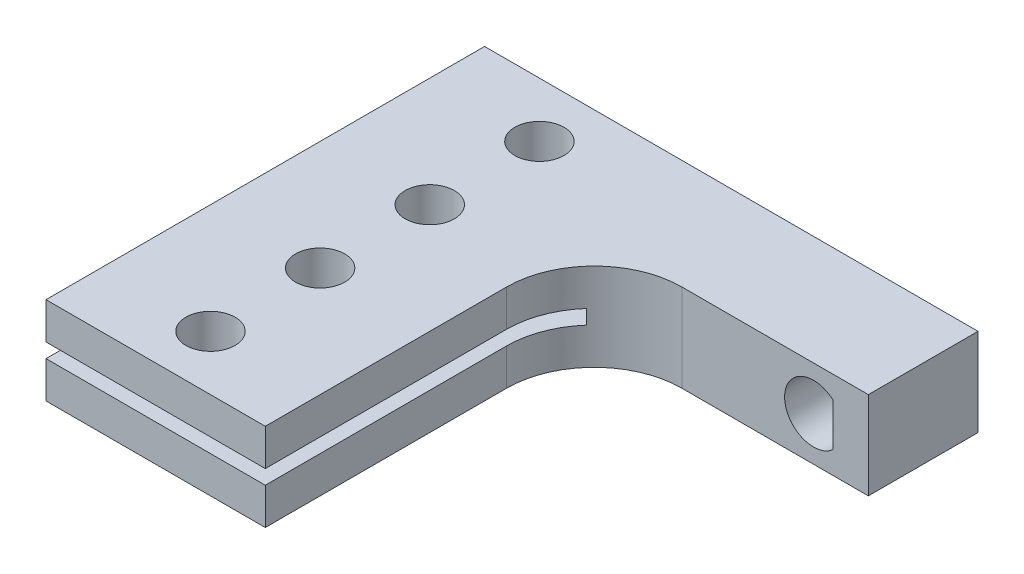
ISO-10303-21;
HEADER;
FILE_DESCRIPTION(('STEP AP214'),'2;1');
FILE_NAME('part.step','',(''),(''),'','','');
FILE_SCHEMA(('AUTOMOTIVE_DESIGN { 1 0 10303 214 1 1 1 1 }'));
ENDSEC;
DATA;
#1=APPLICATION_CONTEXT('core data for automotive mechanical design processes');
#2=APPLICATION_PROTOCOL_DEFINITION('international standard','automotive_design',2000,#1);
#3=PRODUCT_CONTEXT('',#1,'mechanical');
#4=PRODUCT('Part','Part','',(#3));
#5=PRODUCT_RELATED_PRODUCT_CATEGORY('part','',(#4));
#6=PRODUCT_DEFINITION_FORMATION('','',#4);
#7=PRODUCT_DEFINITION_CONTEXT('part definition',#1,'design');
#8=PRODUCT_DEFINITION('design','',#6,#7);
#9=PRODUCT_DEFINITION_SHAPE('','',#8);
#10=(LENGTH_UNIT() NAMED_UNIT(*) SI_UNIT(.MILLI.,.METRE.));
#11=(NAMED_UNIT(*) PLANE_ANGLE_UNIT() SI_UNIT($,.RADIAN.));
#12=(NAMED_UNIT(*) SI_UNIT($,.STERADIAN.) SOLID_ANGLE_UNIT());
#13=UNCERTAINTY_MEASURE_WITH_UNIT(LENGTH_MEASURE(1.E-05),#10,'distance_accuracy_value','');
#14=(GEOMETRIC_REPRESENTATION_CONTEXT(3) GLOBAL_UNCERTAINTY_ASSIGNED_CONTEXT((#13)) GLOBAL_UNIT_ASSIGNED_CONTEXT((#10,
#11,#12)) REPRESENTATION_CONTEXT('',''));
#15=CARTESIAN_POINT('',(0.,0.,0.));
#16=DIRECTION('',(0.,0.,1.));
#17=DIRECTION('',(1.,0.,0.));
#18=AXIS2_PLACEMENT_3D('',#15,#16,#17);
#19=CARTESIAN_POINT('',(-33.0969696969697,5.08,20.0121212121212));
#20=DIRECTION('',(1.,0.,0.));
#21=DIRECTION('',(0.,0.,-1.));
#22=AXIS2_PLACEMENT_3D('',#19,#20,#21);
#23=PLANE('',#22);
#24=DIRECTION('',(0.,-1.,0.));
#25=VECTOR('',#24,1.);
#26=CARTESIAN_POINT('',(-33.0969696969697,5.08,-5.38787878787881));
#27=LINE('',#26,#25);
#28=CARTESIAN_POINT('',(-33.0969696969697,5.08,-5.38787878787881));
#29=VERTEX_POINT('',#28);
#30=CARTESIAN_POINT('',(-33.0969696969697,2.95671875,-5.38787878787881));
#31=VERTEX_POINT('',#30);
#32=EDGE_CURVE('E258',#29,#31,#27,.T.);
#33=ORIENTED_EDGE('',*,*,#32,.T.);
#34=DIRECTION('',(0.,0.,-1.));
#35=VECTOR('',#34,1.);
#36=CARTESIAN_POINT('',(-33.0969696969697,2.95671875,-5.38787878787881));
#37=LINE('',#36,#35);
#38=CARTESIAN_POINT('',(-33.0969696969697,2.95671875,20.0121212121212));
#39=VERTEX_POINT('',#38);
#40=EDGE_CURVE('E206',#39,#31,#37,.T.);
#41=ORIENTED_EDGE('',*,*,#40,.F.);
#42=DIRECTION('',(0.,-1.,0.));
#43=VECTOR('',#42,1.);
#44=CARTESIAN_POINT('',(-33.0969696969697,5.08,20.0121212121212));
#45=LINE('',#44,#43);
#46=CARTESIAN_POINT('',(-33.0969696969697,5.08,20.0121212121212));
#47=VERTEX_POINT('',#46);
#48=EDGE_CURVE('E272',#47,#39,#45,.T.);
#49=ORIENTED_EDGE('',*,*,#48,.F.);
#50=DIRECTION('',(0.,0.,1.));
#51=VECTOR('',#50,1.);
#52=CARTESIAN_POINT('',(-33.0969696969697,5.08,20.0121212121212));
#53=LINE('',#52,#51);
#54=EDGE_CURVE('E227',#29,#47,#53,.T.);
#55=ORIENTED_EDGE('',*,*,#54,.F.);
#56=EDGE_LOOP('',(#33,#41,#49,#55));
#57=FACE_BOUND('',#56,.T.);
#58=ADVANCED_FACE('F35',(#57),#23,.F.);
#59=CARTESIAN_POINT('',(-20.3969696969697,5.08,20.0121212121212));
#60=DIRECTION('',(0.,0.,-1.));
#61=DIRECTION('',(-1.,0.,0.));
#62=AXIS2_PLACEMENT_3D('',#59,#60,#61);
#63=PLANE('',#62);
#64=ORIENTED_EDGE('',*,*,#48,.T.);
#65=DIRECTION('',(-1.,0.,0.));
#66=VECTOR('',#65,1.);
#67=CARTESIAN_POINT('',(-19.1269696969697,2.95671875,20.0121212121212));
#68=LINE('',#67,#66);
#69=CARTESIAN_POINT('',(-20.3969696969697,2.95671875,20.0121212121212));
#70=VERTEX_POINT('',#69);
#71=EDGE_CURVE('E216',#70,#39,#68,.T.);
#72=ORIENTED_EDGE('',*,*,#71,.F.);
#73=DIRECTION('',(0.,-1.,0.));
#74=VECTOR('',#73,1.);
#75=CARTESIAN_POINT('',(-20.3969696969697,5.08,20.0121212121212));
#76=LINE('',#75,#74);
#77=CARTESIAN_POINT('',(-20.3969696969697,5.08,20.0121212121212));
#78=VERTEX_POINT('',#77);
#79=EDGE_CURVE('E268',#78,#70,#76,.T.);
#80=ORIENTED_EDGE('',*,*,#79,.F.);
#81=DIRECTION('',(1.,0.,0.));
#82=VECTOR('',#81,1.);
#83=CARTESIAN_POINT('',(-20.3969696969697,5.08,20.0121212121212));
#84=LINE('',#83,#82);
#85=EDGE_CURVE('E230',#47,#78,#84,.T.);
#86=ORIENTED_EDGE('',*,*,#85,.F.);
#87=EDGE_LOOP('',(#64,#72,#80,#86));
#88=FACE_BOUND('',#87,.T.);
#89=ADVANCED_FACE('F330',(#88),#63,.F.);
#90=CARTESIAN_POINT('',(-20.3969696969697,5.08,0.962121212121189));
#91=DIRECTION('',(-1.,0.,0.));
#92=DIRECTION('',(0.,0.,1.));
#93=AXIS2_PLACEMENT_3D('',#90,#91,#92);
#94=PLANE('',#93);
#95=DIRECTION('',(0.,0.,-1.));
#96=VECTOR('',#95,1.);
#97=CARTESIAN_POINT('',(-20.3969696969697,2.95671875,0.962121212121189));
#98=LINE('',#97,#96);
#99=CARTESIAN_POINT('',(-20.3969696969697,2.95671875,6.04212121212119));
#100=VERTEX_POINT('',#99);
#101=EDGE_CURVE('E223',#70,#100,#98,.T.);
#102=ORIENTED_EDGE('',*,*,#101,.T.);
#103=DIRECTION('',(0.,-1.,0.));
#104=VECTOR('',#103,1.);
#105=CARTESIAN_POINT('',(-20.3969696969697,5.08,6.04212121212119));
#106=LINE('',#105,#104);
#107=CARTESIAN_POINT('',(-20.3969696969697,5.08,6.04212121212119));
#108=VERTEX_POINT('',#107);
#109=EDGE_CURVE('E291',#100,#108,#106,.F.);
#110=ORIENTED_EDGE('',*,*,#109,.T.);
#111=DIRECTION('',(0.,0.,-1.));
#112=VECTOR('',#111,1.);
#113=CARTESIAN_POINT('',(-20.3969696969697,5.08,0.962121212121189));
#114=LINE('',#113,#112);
#115=EDGE_CURVE('E233',#78,#108,#114,.T.);
#116=ORIENTED_EDGE('',*,*,#115,.F.);
#117=ORIENTED_EDGE('',*,*,#79,.T.);
#118=EDGE_LOOP('',(#102,#110,#116,#117));
#119=FACE_BOUND('',#118,.T.);
#120=ADVANCED_FACE('F305',(#119),#94,.F.);
#121=CARTESIAN_POINT('',(-33.0969696969697,2.12328125,20.0121212121212));
#122=VERTEX_POINT('',#121);
#123=CARTESIAN_POINT('',(-33.0969696969697,0.,20.0121212121212));
#124=VERTEX_POINT('',#123);
#125=EDGE_CURVE('E271',#122,#124,#45,.T.);
#126=ORIENTED_EDGE('',*,*,#125,.F.);
#127=DIRECTION('',(0.,0.,1.));
#128=VECTOR('',#127,1.);
#129=CARTESIAN_POINT('',(-33.0969696969697,2.12328125,-5.38787878787881));
#130=LINE('',#129,#128);
#131=CARTESIAN_POINT('',(-33.0969696969697,2.12328125,-5.38787878787881));
#132=VERTEX_POINT('',#131);
#133=EDGE_CURVE('E203',#132,#122,#130,.T.);
#134=ORIENTED_EDGE('',*,*,#133,.F.);
#135=CARTESIAN_POINT('',(-33.0969696969697,0.,-5.38787878787881));
#136=VERTEX_POINT('',#135);
#137=EDGE_CURVE('E242',#132,#136,#27,.T.);
#138=ORIENTED_EDGE('',*,*,#137,.T.);
#139=DIRECTION('',(0.,0.,1.));
#140=VECTOR('',#139,1.);
#141=CARTESIAN_POINT('',(-33.0969696969697,0.,20.0121212121212));
#142=LINE('',#141,#140);
#143=EDGE_CURVE('E226',#136,#124,#142,.T.);
#144=ORIENTED_EDGE('',*,*,#143,.T.);
#145=EDGE_LOOP('',(#126,#134,#138,#144));
#146=FACE_BOUND('',#145,.T.);
#147=ADVANCED_FACE('F341',(#146),#23,.F.);
#148=CARTESIAN_POINT('',(-20.3969696969697,2.12328125,20.0121212121212));
#149=VERTEX_POINT('',#148);
#150=CARTESIAN_POINT('',(-20.3969696969697,0.,20.0121212121212));
#151=VERTEX_POINT('',#150);
#152=EDGE_CURVE('E267',#149,#151,#76,.T.);
#153=ORIENTED_EDGE('',*,*,#152,.F.);
#154=DIRECTION('',(-1.,0.,0.));
#155=VECTOR('',#154,1.);
#156=CARTESIAN_POINT('',(-19.1269696969697,2.12328125,20.0121212121212));
#157=LINE('',#156,#155);
#158=EDGE_CURVE('E218',#149,#122,#157,.T.);
#159=ORIENTED_EDGE('',*,*,#158,.T.);
#160=ORIENTED_EDGE('',*,*,#125,.T.);
#161=DIRECTION('',(1.,0.,0.));
#162=VECTOR('',#161,1.);
#163=CARTESIAN_POINT('',(-20.3969696969697,0.,20.0121212121212));
#164=LINE('',#163,#162);
#165=EDGE_CURVE('E245',#124,#151,#164,.T.);
#166=ORIENTED_EDGE('',*,*,#165,.T.);
#167=EDGE_LOOP('',(#153,#159,#160,#166));
#168=FACE_BOUND('',#167,.T.);
#169=ADVANCED_FACE('F346',(#168),#63,.F.);
#170=DIRECTION('',(0.,0.,-1.));
#171=VECTOR('',#170,1.);
#172=CARTESIAN_POINT('',(-20.3969696969697,0.,0.962121212121189));
#173=LINE('',#172,#171);
#174=CARTESIAN_POINT('',(-20.3969696969697,0.,6.04212121212119));
#175=VERTEX_POINT('',#174);
#176=EDGE_CURVE('E248',#151,#175,#173,.T.);
#177=ORIENTED_EDGE('',*,*,#176,.T.);
#178=DIRECTION('',(0.,1.,0.));
#179=VECTOR('',#178,1.);
#180=CARTESIAN_POINT('',(-20.3969696969697,1.061640625,6.04212121212119));
#181=LINE('',#180,#179);
#182=CARTESIAN_POINT('',(-20.3969696969697,2.12328125,6.04212121212119));
#183=VERTEX_POINT('',#182);
#184=EDGE_CURVE('E289',#175,#183,#181,.T.);
#185=ORIENTED_EDGE('',*,*,#184,.T.);
#186=DIRECTION('',(0.,0.,1.));
#187=VECTOR('',#186,1.);
#188=CARTESIAN_POINT('',(-20.3969696969697,2.12328125,0.962121212121189));
#189=LINE('',#188,#187);
#190=EDGE_CURVE('E215',#183,#149,#189,.T.);
#191=ORIENTED_EDGE('',*,*,#190,.T.);
#192=ORIENTED_EDGE('',*,*,#152,.T.);
#193=EDGE_LOOP('',(#177,#185,#191,#192));
#194=FACE_BOUND('',#193,.T.);
#195=ADVANCED_FACE('F352',(#194),#94,.F.);
#196=CARTESIAN_POINT('',(-4.52196969696969,5.08,0.962121212121185));
#197=DIRECTION('',(0.,0.,-1.));
#198=DIRECTION('',(-1.,0.,0.));
#199=AXIS2_PLACEMENT_3D('',#196,#197,#198);
#200=PLANE('',#199);
#201=DIRECTION('',(0.,1.,0.));
#202=VECTOR('',#201,1.);
#203=CARTESIAN_POINT('',(-6.57936969696969,1.29048521417312,0.962121212121184));
#204=LINE('',#203,#202);
#205=CARTESIAN_POINT('',(-6.57936969696969,1.29048521417312,0.962121212121186));
#206=VERTEX_POINT('',#205);
#207=CARTESIAN_POINT('',(-6.57936969696969,3.78951478582688,0.962121212121184));
#208=VERTEX_POINT('',#207);
#209=EDGE_CURVE('E155',#206,#208,#204,.T.);
#210=ORIENTED_EDGE('',*,*,#209,.F.);
#211=CARTESIAN_POINT('',(-7.69696969696969,2.54,0.962121212121184));
#212=DIRECTION('',(0.,0.,1.));
#213=DIRECTION('',(1.,0.,0.));
#214=AXIS2_PLACEMENT_3D('',#211,#212,#213);
#215=CIRCLE('',#214,1.6764);
#216=EDGE_CURVE('E145',#208,#206,#215,.T.);
#217=ORIENTED_EDGE('',*,*,#216,.F.);
#218=EDGE_LOOP('',(#210,#217));
#219=FACE_BOUND('',#218,.T.);
#220=DIRECTION('',(1.,0.,0.));
#221=VECTOR('',#220,1.);
#222=CARTESIAN_POINT('',(-4.52196969696969,5.08,0.962121212121185));
#223=LINE('',#222,#221);
#224=CARTESIAN_POINT('',(-15.3169696969697,5.08,0.962121212121188));
#225=VERTEX_POINT('',#224);
#226=CARTESIAN_POINT('',(-4.52196969696969,5.08,0.962121212121185));
#227=VERTEX_POINT('',#226);
#228=EDGE_CURVE('E236',#225,#227,#223,.T.);
#229=ORIENTED_EDGE('',*,*,#228,.F.);
#230=DIRECTION('',(0.,-1.,0.));
#231=VECTOR('',#230,1.);
#232=CARTESIAN_POINT('',(-15.3169696969697,2.95671875,0.962121212121188));
#233=LINE('',#232,#231);
#234=CARTESIAN_POINT('',(-15.3169696969697,0.,0.962121212121188));
#235=VERTEX_POINT('',#234);
#236=EDGE_CURVE('E286',#225,#235,#233,.T.);
#237=ORIENTED_EDGE('',*,*,#236,.T.);
#238=DIRECTION('',(1.,0.,0.));
#239=VECTOR('',#238,1.);
#240=CARTESIAN_POINT('',(-4.52196969696969,0.,0.962121212121185));
#241=LINE('',#240,#239);
#242=CARTESIAN_POINT('',(-4.52196969696969,0.,0.962121212121185));
#243=VERTEX_POINT('',#242);
#244=EDGE_CURVE('E251',#235,#243,#241,.T.);
#245=ORIENTED_EDGE('',*,*,#244,.T.);
#246=DIRECTION('',(0.,-1.,0.));
#247=VECTOR('',#246,1.);
#248=CARTESIAN_POINT('',(-4.52196969696969,5.08,0.962121212121185));
#249=LINE('',#248,#247);
#250=EDGE_CURVE('E264',#227,#243,#249,.T.);
#251=ORIENTED_EDGE('',*,*,#250,.F.);
#252=EDGE_LOOP('',(#229,#237,#245,#251));
#253=FACE_BOUND('',#252,.T.);
#254=ADVANCED_FACE('F159',(#219,#253),#200,.F.);
#255=CARTESIAN_POINT('',(-4.52196969696969,5.08,-5.38787878787881));
#256=DIRECTION('',(-1.,0.,0.));
#257=DIRECTION('',(0.,0.,1.));
#258=AXIS2_PLACEMENT_3D('',#255,#256,#257);
#259=PLANE('',#258);
#260=DIRECTION('',(0.,0.,-1.));
#261=VECTOR('',#260,1.);
#262=CARTESIAN_POINT('',(-4.52196969696969,0.,-5.38787878787881));
#263=LINE('',#262,#261);
#264=CARTESIAN_POINT('',(-4.52196969696969,0.,-5.38787878787881));
#265=VERTEX_POINT('',#264);
#266=EDGE_CURVE('E253',#243,#265,#263,.T.);
#267=ORIENTED_EDGE('',*,*,#266,.T.);
#268=DIRECTION('',(0.,-1.,0.));
#269=VECTOR('',#268,1.);
#270=CARTESIAN_POINT('',(-4.52196969696969,5.08,-5.38787878787881));
#271=LINE('',#270,#269);
#272=CARTESIAN_POINT('',(-4.52196969696969,5.08,-5.38787878787881));
#273=VERTEX_POINT('',#272);
#274=EDGE_CURVE('E261',#273,#265,#271,.T.);
#275=ORIENTED_EDGE('',*,*,#274,.F.);
#276=DIRECTION('',(0.,0.,-1.));
#277=VECTOR('',#276,1.);
#278=CARTESIAN_POINT('',(-4.52196969696969,5.08,-5.38787878787881));
#279=LINE('',#278,#277);
#280=EDGE_CURVE('E238',#227,#273,#279,.T.);
#281=ORIENTED_EDGE('',*,*,#280,.F.);
#282=ORIENTED_EDGE('',*,*,#250,.T.);
#283=EDGE_LOOP('',(#267,#275,#281,#282));
#284=FACE_BOUND('',#283,.T.);
#285=ADVANCED_FACE('F319',(#284),#259,.F.);
#286=CARTESIAN_POINT('',(-33.0969696969697,5.08,-5.38787878787881));
#287=DIRECTION('',(0.,0.,1.));
#288=DIRECTION('',(1.,0.,0.));
#289=AXIS2_PLACEMENT_3D('',#286,#287,#288);
#290=PLANE('',#289);
#291=DIRECTION('',(0.,1.,0.));
#292=VECTOR('',#291,1.);
#293=CARTESIAN_POINT('',(-6.57936969696969,5.08,-5.3878787878788));
#294=LINE('',#293,#292);
#295=CARTESIAN_POINT('',(-6.57936969696969,1.29048521417312,-5.3878787878788));
#296=VERTEX_POINT('',#295);
#297=CARTESIAN_POINT('',(-6.57936969696969,3.78951478582688,-5.3878787878788));
#298=VERTEX_POINT('',#297);
#299=EDGE_CURVE('E275',#296,#298,#294,.T.);
#300=ORIENTED_EDGE('',*,*,#299,.T.);
#301=CARTESIAN_POINT('',(-7.69696969696969,2.54,-5.3878787878788));
#302=DIRECTION('',(0.,0.,1.));
#303=DIRECTION('',(1.,0.,0.));
#304=AXIS2_PLACEMENT_3D('',#301,#302,#303);
#305=CIRCLE('',#304,1.6764);
#306=EDGE_CURVE('E148',#298,#296,#305,.T.);
#307=ORIENTED_EDGE('',*,*,#306,.T.);
#308=EDGE_LOOP('',(#300,#307));
#309=FACE_BOUND('',#308,.T.);
#310=DIRECTION('',(0.,-1.,0.));
#311=VECTOR('',#310,1.);
#312=CARTESIAN_POINT('',(-19.1269696969697,2.95671875,-5.38787878787881));
#313=LINE('',#312,#311);
#314=CARTESIAN_POINT('',(-19.1269696969697,2.95671875,-5.3878787878788));
#315=VERTEX_POINT('',#314);
#316=CARTESIAN_POINT('',(-19.1269696969697,2.12328125,-5.38787878787881));
#317=VERTEX_POINT('',#316);
#318=EDGE_CURVE('E204',#315,#317,#313,.T.);
#319=ORIENTED_EDGE('',*,*,#318,.F.);
#320=DIRECTION('',(-1.,0.,0.));
#321=VECTOR('',#320,1.);
#322=CARTESIAN_POINT('',(-19.1269696969697,2.95671875,-5.38787878787881));
#323=LINE('',#322,#321);
#324=EDGE_CURVE('E212',#315,#31,#323,.T.);
#325=ORIENTED_EDGE('',*,*,#324,.T.);
#326=ORIENTED_EDGE('',*,*,#32,.F.);
#327=DIRECTION('',(-1.,0.,0.));
#328=VECTOR('',#327,1.);
#329=CARTESIAN_POINT('',(-20.3969696969697,5.08,-5.3878787878788));
#330=LINE('',#329,#328);
#331=EDGE_CURVE('E240',#273,#29,#330,.T.);
#332=ORIENTED_EDGE('',*,*,#331,.F.);
#333=ORIENTED_EDGE('',*,*,#274,.T.);
#334=DIRECTION('',(-1.,0.,0.));
#335=VECTOR('',#334,1.);
#336=CARTESIAN_POINT('',(-33.0969696969697,0.,-5.38787878787881));
#337=LINE('',#336,#335);
#338=EDGE_CURVE('E231',#265,#136,#337,.T.);
#339=ORIENTED_EDGE('',*,*,#338,.T.);
#340=ORIENTED_EDGE('',*,*,#137,.F.);
#341=DIRECTION('',(-1.,0.,0.));
#342=VECTOR('',#341,1.);
#343=CARTESIAN_POINT('',(-19.1269696969697,2.12328125,-5.38787878787881));
#344=LINE('',#343,#342);
#345=EDGE_CURVE('E209',#317,#132,#344,.T.);
#346=ORIENTED_EDGE('',*,*,#345,.F.);
#347=EDGE_LOOP('',(#319,#325,#326,#332,#333,#339,#340,#346));
#348=FACE_BOUND('',#347,.T.);
#349=ADVANCED_FACE('F326',(#309,#348),#290,.F.);
#350=CARTESIAN_POINT('',(0.,5.08,0.));
#351=DIRECTION('',(0.,-1.,0.));
#352=DIRECTION('',(0.,0.,-1.));
#353=AXIS2_PLACEMENT_3D('',#350,#351,#352);
#354=PLANE('',#353);
#355=CARTESIAN_POINT('',(-26.7469696969697,5.08,-2.21287878787881));
#356=DIRECTION('',(0.,1.,0.));
#357=DIRECTION('',(0.,0.,1.));
#358=AXIS2_PLACEMENT_3D('',#355,#356,#357);
#359=CIRCLE('',#358,1.4224);
#360=CARTESIAN_POINT('',(-26.7469696969697,5.08,-0.790478787878804));
#361=VERTEX_POINT('',#360);
#362=EDGE_CURVE('E151',#361,#361,#359,.T.);
#363=ORIENTED_EDGE('',*,*,#362,.F.);
#364=EDGE_LOOP('',(#363));
#365=FACE_BOUND('',#364,.T.);
#366=CARTESIAN_POINT('',(-26.7469696969697,5.08,4.13712121212119));
#367=DIRECTION('',(0.,1.,0.));
#368=DIRECTION('',(0.,0.,1.));
#369=AXIS2_PLACEMENT_3D('',#366,#367,#368);
#370=CIRCLE('',#369,1.4224);
#371=CARTESIAN_POINT('',(-26.7469696969697,5.08,5.55952121212119));
#372=VERTEX_POINT('',#371);
#373=EDGE_CURVE('E173',#372,#372,#370,.T.);
#374=ORIENTED_EDGE('',*,*,#373,.F.);
#375=EDGE_LOOP('',(#374));
#376=FACE_BOUND('',#375,.T.);
#377=CARTESIAN_POINT('',(-26.7469696969697,5.08,10.4871212121212));
#378=DIRECTION('',(0.,1.,0.));
#379=DIRECTION('',(0.,0.,1.));
#380=AXIS2_PLACEMENT_3D('',#377,#378,#379);
#381=CIRCLE('',#380,1.4224);
#382=CARTESIAN_POINT('',(-26.7469696969697,5.08,11.9095212121212));
#383=VERTEX_POINT('',#382);
#384=EDGE_CURVE('E183',#383,#383,#381,.T.);
#385=ORIENTED_EDGE('',*,*,#384,.F.);
#386=EDGE_LOOP('',(#385));
#387=FACE_BOUND('',#386,.T.);
#388=CARTESIAN_POINT('',(-26.7469696969697,5.08,16.8371212121212));
#389=DIRECTION('',(0.,1.,0.));
#390=DIRECTION('',(0.,0.,1.));
#391=AXIS2_PLACEMENT_3D('',#388,#389,#390);
#392=CIRCLE('',#391,1.4224);
#393=CARTESIAN_POINT('',(-26.7469696969697,5.08,18.2595212121212));
#394=VERTEX_POINT('',#393);
#395=EDGE_CURVE('E193',#394,#394,#392,.T.);
#396=ORIENTED_EDGE('',*,*,#395,.F.);
#397=EDGE_LOOP('',(#396));
#398=FACE_BOUND('',#397,.T.);
#399=ORIENTED_EDGE('',*,*,#54,.T.);
#400=ORIENTED_EDGE('',*,*,#85,.T.);
#401=ORIENTED_EDGE('',*,*,#115,.T.);
#402=CARTESIAN_POINT('',(-15.3169696969697,5.08,6.04212121212119));
#403=DIRECTION('',(0.,-1.,0.));
#404=DIRECTION('',(0.,0.,-1.));
#405=AXIS2_PLACEMENT_3D('',#402,#403,#404);
#406=CIRCLE('',#405,5.08);
#407=EDGE_CURVE('E11',#108,#225,#406,.T.);
#408=ORIENTED_EDGE('',*,*,#407,.T.);
#409=ORIENTED_EDGE('',*,*,#228,.T.);
#410=ORIENTED_EDGE('',*,*,#280,.T.);
#411=ORIENTED_EDGE('',*,*,#331,.T.);
#412=EDGE_LOOP('',(#399,#400,#401,#408,#409,#410,#411));
#413=FACE_BOUND('',#412,.T.);
#414=ADVANCED_FACE('F312',(#365,#376,#387,#398,#413),#354,.F.);
#415=CARTESIAN_POINT('',(0.,0.,0.));
#416=DIRECTION('',(0.,-1.,0.));
#417=DIRECTION('',(0.,0.,-1.));
#418=AXIS2_PLACEMENT_3D('',#415,#416,#417);
#419=PLANE('',#418);
#420=CARTESIAN_POINT('',(-26.7469696969697,0.,-2.21287878787881));
#421=DIRECTION('',(0.,-1.,0.));
#422=DIRECTION('',(0.,0.,-1.));
#423=AXIS2_PLACEMENT_3D('',#420,#421,#422);
#424=CIRCLE('',#423,1.4224);
#425=CARTESIAN_POINT('',(-26.7469696969697,0.,-3.63527878787881));
#426=VERTEX_POINT('',#425);
#427=EDGE_CURVE('E170',#426,#426,#424,.T.);
#428=ORIENTED_EDGE('',*,*,#427,.F.);
#429=EDGE_LOOP('',(#428));
#430=FACE_BOUND('',#429,.T.);
#431=CARTESIAN_POINT('',(-26.7469696969697,0.,4.13712121212119));
#432=DIRECTION('',(0.,-1.,0.));
#433=DIRECTION('',(0.,0.,-1.));
#434=AXIS2_PLACEMENT_3D('',#431,#432,#433);
#435=CIRCLE('',#434,1.4224);
#436=CARTESIAN_POINT('',(-26.7469696969697,0.,2.71472121212119));
#437=VERTEX_POINT('',#436);
#438=EDGE_CURVE('E180',#437,#437,#435,.T.);
#439=ORIENTED_EDGE('',*,*,#438,.F.);
#440=EDGE_LOOP('',(#439));
#441=FACE_BOUND('',#440,.T.);
#442=CARTESIAN_POINT('',(-26.7469696969697,0.,10.4871212121212));
#443=DIRECTION('',(0.,-1.,0.));
#444=DIRECTION('',(0.,0.,-1.));
#445=AXIS2_PLACEMENT_3D('',#442,#443,#444);
#446=CIRCLE('',#445,1.4224);
#447=CARTESIAN_POINT('',(-26.7469696969697,0.,9.06472121212119));
#448=VERTEX_POINT('',#447);
#449=EDGE_CURVE('E190',#448,#448,#446,.T.);
#450=ORIENTED_EDGE('',*,*,#449,.F.);
#451=EDGE_LOOP('',(#450));
#452=FACE_BOUND('',#451,.T.);
#453=CARTESIAN_POINT('',(-26.7469696969697,0.,16.8371212121212));
#454=DIRECTION('',(0.,-1.,0.));
#455=DIRECTION('',(0.,0.,-1.));
#456=AXIS2_PLACEMENT_3D('',#453,#454,#455);
#457=CIRCLE('',#456,1.4224);
#458=CARTESIAN_POINT('',(-26.7469696969697,0.,15.4147212121212));
#459=VERTEX_POINT('',#458);
#460=EDGE_CURVE('E200',#459,#459,#457,.T.);
#461=ORIENTED_EDGE('',*,*,#460,.F.);
#462=EDGE_LOOP('',(#461));
#463=FACE_BOUND('',#462,.T.);
#464=ORIENTED_EDGE('',*,*,#143,.F.);
#465=ORIENTED_EDGE('',*,*,#338,.F.);
#466=ORIENTED_EDGE('',*,*,#266,.F.);
#467=ORIENTED_EDGE('',*,*,#244,.F.);
#468=CARTESIAN_POINT('',(-15.3169696969697,0.,6.04212121212119));
#469=DIRECTION('',(0.,-1.,0.));
#470=DIRECTION('',(0.,0.,-1.));
#471=AXIS2_PLACEMENT_3D('',#468,#469,#470);
#472=CIRCLE('',#471,5.08);
#473=EDGE_CURVE('E293',#235,#175,#472,.F.);
#474=ORIENTED_EDGE('',*,*,#473,.T.);
#475=ORIENTED_EDGE('',*,*,#176,.F.);
#476=ORIENTED_EDGE('',*,*,#165,.F.);
#477=EDGE_LOOP('',(#464,#465,#466,#467,#474,#475,#476));
#478=FACE_BOUND('',#477,.T.);
#479=ADVANCED_FACE('F349',(#430,#441,#452,#463,#478),#419,.T.);
#480=CARTESIAN_POINT('',(-19.1269696969697,2.95671875,-5.38787878787881));
#481=DIRECTION('',(0.,1.,0.));
#482=DIRECTION('',(0.,0.,1.));
#483=AXIS2_PLACEMENT_3D('',#480,#481,#482);
#484=PLANE('',#483);
#485=CARTESIAN_POINT('',(-26.7469696969697,2.95671875,-2.21287878787881));
#486=DIRECTION('',(0.,1.,0.));
#487=DIRECTION('',(0.,0.,1.));
#488=AXIS2_PLACEMENT_3D('',#485,#486,#487);
#489=CIRCLE('',#488,1.4224);
#490=CARTESIAN_POINT('',(-26.7469696969697,2.95671875,-0.790478787878804));
#491=VERTEX_POINT('',#490);
#492=EDGE_CURVE('E167',#491,#491,#489,.T.);
#493=ORIENTED_EDGE('',*,*,#492,.T.);
#494=EDGE_LOOP('',(#493));
#495=FACE_BOUND('',#494,.T.);
#496=CARTESIAN_POINT('',(-26.7469696969697,2.95671875,4.13712121212119));
#497=DIRECTION('',(0.,1.,0.));
#498=DIRECTION('',(0.,0.,1.));
#499=AXIS2_PLACEMENT_3D('',#496,#497,#498);
#500=CIRCLE('',#499,1.4224);
#501=CARTESIAN_POINT('',(-26.7469696969697,2.95671875,5.55952121212119));
#502=VERTEX_POINT('',#501);
#503=EDGE_CURVE('E177',#502,#502,#500,.T.);
#504=ORIENTED_EDGE('',*,*,#503,.T.);
#505=EDGE_LOOP('',(#504));
#506=FACE_BOUND('',#505,.T.);
#507=CARTESIAN_POINT('',(-26.7469696969697,2.95671875,10.4871212121212));
#508=DIRECTION('',(0.,1.,0.));
#509=DIRECTION('',(0.,0.,1.));
#510=AXIS2_PLACEMENT_3D('',#507,#508,#509);
#511=CIRCLE('',#510,1.4224);
#512=CARTESIAN_POINT('',(-26.7469696969697,2.95671875,11.9095212121212));
#513=VERTEX_POINT('',#512);
#514=EDGE_CURVE('E187',#513,#513,#511,.T.);
#515=ORIENTED_EDGE('',*,*,#514,.T.);
#516=EDGE_LOOP('',(#515));
#517=FACE_BOUND('',#516,.T.);
#518=CARTESIAN_POINT('',(-26.7469696969697,2.95671875,16.8371212121212));
#519=DIRECTION('',(0.,1.,0.));
#520=DIRECTION('',(0.,0.,1.));
#521=AXIS2_PLACEMENT_3D('',#518,#519,#520);
#522=CIRCLE('',#521,1.4224);
#523=CARTESIAN_POINT('',(-26.7469696969697,2.95671875,18.2595212121212));
#524=VERTEX_POINT('',#523);
#525=EDGE_CURVE('E197',#524,#524,#522,.T.);
#526=ORIENTED_EDGE('',*,*,#525,.T.);
#527=EDGE_LOOP('',(#526));
#528=FACE_BOUND('',#527,.T.);
#529=ORIENTED_EDGE('',*,*,#71,.T.);
#530=ORIENTED_EDGE('',*,*,#40,.T.);
#531=ORIENTED_EDGE('',*,*,#324,.F.);
#532=DIRECTION('',(0.,0.,-1.));
#533=VECTOR('',#532,1.);
#534=CARTESIAN_POINT('',(-19.1269696969697,2.95671875,-5.38787878787881));
#535=LINE('',#534,#533);
#536=CARTESIAN_POINT('',(-19.1269696969697,2.95671875,2.68201704706915));
#537=VERTEX_POINT('',#536);
#538=EDGE_CURVE('E50',#537,#315,#535,.T.);
#539=ORIENTED_EDGE('',*,*,#538,.F.);
#540=CARTESIAN_POINT('',(-15.3169696969697,2.95671875,6.04212121212119));
#541=DIRECTION('',(0.,1.,0.));
#542=DIRECTION('',(0.,0.,1.));
#543=AXIS2_PLACEMENT_3D('',#540,#541,#542);
#544=CIRCLE('',#543,5.08);
#545=EDGE_CURVE('E43',#537,#100,#544,.T.);
#546=ORIENTED_EDGE('',*,*,#545,.T.);
#547=ORIENTED_EDGE('',*,*,#101,.F.);
#548=EDGE_LOOP('',(#529,#530,#531,#539,#546,#547));
#549=FACE_BOUND('',#548,.T.);
#550=ADVANCED_FACE('F299',(#495,#506,#517,#528,#549),#484,.F.);
#551=CARTESIAN_POINT('',(-19.1269696969697,2.12328125,-5.38787878787881));
#552=DIRECTION('',(0.,-1.,0.));
#553=DIRECTION('',(0.,0.,-1.));
#554=AXIS2_PLACEMENT_3D('',#551,#552,#553);
#555=PLANE('',#554);
#556=CARTESIAN_POINT('',(-26.7469696969697,2.12328125,-2.21287878787881));
#557=DIRECTION('',(0.,-1.,0.));
#558=DIRECTION('',(0.,0.,-1.));
#559=AXIS2_PLACEMENT_3D('',#556,#557,#558);
#560=CIRCLE('',#559,1.4224);
#561=CARTESIAN_POINT('',(-26.7469696969697,2.12328125,-3.63527878787881));
#562=VERTEX_POINT('',#561);
#563=EDGE_CURVE('E166',#562,#562,#560,.T.);
#564=ORIENTED_EDGE('',*,*,#563,.T.);
#565=EDGE_LOOP('',(#564));
#566=FACE_BOUND('',#565,.T.);
#567=CARTESIAN_POINT('',(-26.7469696969697,2.12328125,4.13712121212119));
#568=DIRECTION('',(0.,-1.,0.));
#569=DIRECTION('',(0.,0.,-1.));
#570=AXIS2_PLACEMENT_3D('',#567,#568,#569);
#571=CIRCLE('',#570,1.4224);
#572=CARTESIAN_POINT('',(-26.7469696969697,2.12328125,2.71472121212119));
#573=VERTEX_POINT('',#572);
#574=EDGE_CURVE('E176',#573,#573,#571,.T.);
#575=ORIENTED_EDGE('',*,*,#574,.T.);
#576=EDGE_LOOP('',(#575));
#577=FACE_BOUND('',#576,.T.);
#578=CARTESIAN_POINT('',(-26.7469696969697,2.12328125,10.4871212121212));
#579=DIRECTION('',(0.,-1.,0.));
#580=DIRECTION('',(0.,0.,-1.));
#581=AXIS2_PLACEMENT_3D('',#578,#579,#580);
#582=CIRCLE('',#581,1.4224);
#583=CARTESIAN_POINT('',(-26.7469696969697,2.12328125,9.06472121212119));
#584=VERTEX_POINT('',#583);
#585=EDGE_CURVE('E186',#584,#584,#582,.T.);
#586=ORIENTED_EDGE('',*,*,#585,.T.);
#587=EDGE_LOOP('',(#586));
#588=FACE_BOUND('',#587,.T.);
#589=CARTESIAN_POINT('',(-26.7469696969697,2.12328125,16.8371212121212));
#590=DIRECTION('',(0.,-1.,0.));
#591=DIRECTION('',(0.,0.,-1.));
#592=AXIS2_PLACEMENT_3D('',#589,#590,#591);
#593=CIRCLE('',#592,1.4224);
#594=CARTESIAN_POINT('',(-26.7469696969697,2.12328125,15.4147212121212));
#595=VERTEX_POINT('',#594);
#596=EDGE_CURVE('E196',#595,#595,#593,.T.);
#597=ORIENTED_EDGE('',*,*,#596,.T.);
#598=EDGE_LOOP('',(#597));
#599=FACE_BOUND('',#598,.T.);
#600=ORIENTED_EDGE('',*,*,#190,.F.);
#601=CARTESIAN_POINT('',(-15.3169696969697,2.12328125,6.04212121212119));
#602=DIRECTION('',(0.,-1.,0.));
#603=DIRECTION('',(0.,0.,-1.));
#604=AXIS2_PLACEMENT_3D('',#601,#602,#603);
#605=CIRCLE('',#604,5.08);
#606=CARTESIAN_POINT('',(-19.1269696969697,2.12328125,2.68201704706915));
#607=VERTEX_POINT('',#606);
#608=EDGE_CURVE('E295',#183,#607,#605,.T.);
#609=ORIENTED_EDGE('',*,*,#608,.T.);
#610=DIRECTION('',(0.,0.,1.));
#611=VECTOR('',#610,1.);
#612=CARTESIAN_POINT('',(-19.1269696969697,2.12328125,-5.38787878787881));
#613=LINE('',#612,#611);
#614=EDGE_CURVE('E57',#317,#607,#613,.T.);
#615=ORIENTED_EDGE('',*,*,#614,.F.);
#616=ORIENTED_EDGE('',*,*,#345,.T.);
#617=ORIENTED_EDGE('',*,*,#133,.T.);
#618=ORIENTED_EDGE('',*,*,#158,.F.);
#619=EDGE_LOOP('',(#600,#609,#615,#616,#617,#618));
#620=FACE_BOUND('',#619,.T.);
#621=ADVANCED_FACE('F337',(#566,#577,#588,#599,#620),#555,.F.);
#622=CARTESIAN_POINT('',(-19.1269696969697,0.,0.));
#623=DIRECTION('',(-1.,0.,0.));
#624=DIRECTION('',(0.,0.,1.));
#625=AXIS2_PLACEMENT_3D('',#622,#623,#624);
#626=PLANE('',#625);
#627=ORIENTED_EDGE('',*,*,#614,.T.);
#628=DIRECTION('',(0.,1.,0.));
#629=VECTOR('',#628,1.);
#630=CARTESIAN_POINT('',(-19.1269696969697,2.12328125,2.68201704706915));
#631=LINE('',#630,#629);
#632=EDGE_CURVE('E297',#607,#537,#631,.T.);
#633=ORIENTED_EDGE('',*,*,#632,.T.);
#634=ORIENTED_EDGE('',*,*,#538,.T.);
#635=ORIENTED_EDGE('',*,*,#318,.T.);
#636=EDGE_LOOP('',(#627,#633,#634,#635));
#637=FACE_BOUND('',#636,.T.);
#638=ADVANCED_FACE('F331',(#637),#626,.T.);
#639=CARTESIAN_POINT('',(-26.7469696969697,-7.62,16.8371212121212));
#640=DIRECTION('',(0.,1.,0.));
#641=DIRECTION('',(0.,0.,1.));
#642=AXIS2_PLACEMENT_3D('',#639,#640,#641);
#643=CYLINDRICAL_SURFACE('',#642,1.4224);
#644=ORIENTED_EDGE('',*,*,#460,.T.);
#645=EDGE_LOOP('',(#644));
#646=FACE_BOUND('',#645,.T.);
#647=ORIENTED_EDGE('',*,*,#596,.F.);
#648=EDGE_LOOP('',(#647));
#649=FACE_BOUND('',#648,.T.);
#650=ADVANCED_FACE('F383',(#646,#649),#643,.F.);
#651=ORIENTED_EDGE('',*,*,#395,.T.);
#652=EDGE_LOOP('',(#651));
#653=FACE_BOUND('',#652,.T.);
#654=ORIENTED_EDGE('',*,*,#525,.F.);
#655=EDGE_LOOP('',(#654));
#656=FACE_BOUND('',#655,.T.);
#657=ADVANCED_FACE('F388',(#653,#656),#643,.F.);
#658=CARTESIAN_POINT('',(-26.7469696969697,-7.62,10.4871212121212));
#659=DIRECTION('',(0.,1.,0.));
#660=DIRECTION('',(0.,0.,1.));
#661=AXIS2_PLACEMENT_3D('',#658,#659,#660);
#662=CYLINDRICAL_SURFACE('',#661,1.4224);
#663=ORIENTED_EDGE('',*,*,#449,.T.);
#664=EDGE_LOOP('',(#663));
#665=FACE_BOUND('',#664,.T.);
#666=ORIENTED_EDGE('',*,*,#585,.F.);
#667=EDGE_LOOP('',(#666));
#668=FACE_BOUND('',#667,.T.);
#669=ADVANCED_FACE('F400',(#665,#668),#662,.F.);
#670=ORIENTED_EDGE('',*,*,#384,.T.);
#671=EDGE_LOOP('',(#670));
#672=FACE_BOUND('',#671,.T.);
#673=ORIENTED_EDGE('',*,*,#514,.F.);
#674=EDGE_LOOP('',(#673));
#675=FACE_BOUND('',#674,.T.);
#676=ADVANCED_FACE('F409',(#672,#675),#662,.F.);
#677=CARTESIAN_POINT('',(-26.7469696969697,-7.62,4.13712121212119));
#678=DIRECTION('',(0.,1.,0.));
#679=DIRECTION('',(0.,0.,1.));
#680=AXIS2_PLACEMENT_3D('',#677,#678,#679);
#681=CYLINDRICAL_SURFACE('',#680,1.4224);
#682=ORIENTED_EDGE('',*,*,#438,.T.);
#683=EDGE_LOOP('',(#682));
#684=FACE_BOUND('',#683,.T.);
#685=ORIENTED_EDGE('',*,*,#574,.F.);
#686=EDGE_LOOP('',(#685));
#687=FACE_BOUND('',#686,.T.);
#688=ADVANCED_FACE('F419',(#684,#687),#681,.F.);
#689=ORIENTED_EDGE('',*,*,#373,.T.);
#690=EDGE_LOOP('',(#689));
#691=FACE_BOUND('',#690,.T.);
#692=ORIENTED_EDGE('',*,*,#503,.F.);
#693=EDGE_LOOP('',(#692));
#694=FACE_BOUND('',#693,.T.);
#695=ADVANCED_FACE('F428',(#691,#694),#681,.F.);
#696=CARTESIAN_POINT('',(-26.7469696969697,-7.62,-2.21287878787881));
#697=DIRECTION('',(0.,1.,0.));
#698=DIRECTION('',(0.,0.,1.));
#699=AXIS2_PLACEMENT_3D('',#696,#697,#698);
#700=CYLINDRICAL_SURFACE('',#699,1.4224);
#701=ORIENTED_EDGE('',*,*,#427,.T.);
#702=EDGE_LOOP('',(#701));
#703=FACE_BOUND('',#702,.T.);
#704=ORIENTED_EDGE('',*,*,#563,.F.);
#705=EDGE_LOOP('',(#704));
#706=FACE_BOUND('',#705,.T.);
#707=ADVANCED_FACE('F438',(#703,#706),#700,.F.);
#708=ORIENTED_EDGE('',*,*,#362,.T.);
#709=EDGE_LOOP('',(#708));
#710=FACE_BOUND('',#709,.T.);
#711=ORIENTED_EDGE('',*,*,#492,.F.);
#712=EDGE_LOOP('',(#711));
#713=FACE_BOUND('',#712,.T.);
#714=ADVANCED_FACE('F447',(#710,#713),#700,.F.);
#715=CARTESIAN_POINT('',(-7.69696969696969,2.54,-11.7378787878788));
#716=DIRECTION('',(0.,0.,1.));
#717=DIRECTION('',(1.,0.,0.));
#718=AXIS2_PLACEMENT_3D('',#715,#716,#717);
#719=CYLINDRICAL_SURFACE('',#718,1.6764);
#720=DIRECTION('',(0.,0.,1.));
#721=VECTOR('',#720,1.);
#722=CARTESIAN_POINT('',(-6.57936969696969,3.78951478582688,-11.7378787878788));
#723=LINE('',#722,#721);
#724=EDGE_CURVE('E140',#298,#208,#723,.T.);
#725=ORIENTED_EDGE('',*,*,#724,.T.);
#726=ORIENTED_EDGE('',*,*,#216,.T.);
#727=DIRECTION('',(0.,0.,1.));
#728=VECTOR('',#727,1.);
#729=CARTESIAN_POINT('',(-6.57936969696969,1.29048521417312,-11.7378787878788));
#730=LINE('',#729,#728);
#731=EDGE_CURVE('E152',#296,#206,#730,.T.);
#732=ORIENTED_EDGE('',*,*,#731,.F.);
#733=ORIENTED_EDGE('',*,*,#306,.F.);
#734=EDGE_LOOP('',(#725,#726,#732,#733));
#735=FACE_BOUND('',#734,.T.);
#736=ADVANCED_FACE('F142',(#735),#719,.F.);
#737=CARTESIAN_POINT('',(-6.57936969696969,1.29048521417312,-11.7378787878788));
#738=DIRECTION('',(1.,0.,0.));
#739=DIRECTION('',(0.,0.,-1.));
#740=AXIS2_PLACEMENT_3D('',#737,#738,#739);
#741=PLANE('',#740);
#742=ORIENTED_EDGE('',*,*,#731,.T.);
#743=ORIENTED_EDGE('',*,*,#209,.T.);
#744=ORIENTED_EDGE('',*,*,#724,.F.);
#745=ORIENTED_EDGE('',*,*,#299,.F.);
#746=EDGE_LOOP('',(#742,#743,#744,#745));
#747=FACE_BOUND('',#746,.T.);
#748=ADVANCED_FACE('F156',(#747),#741,.F.);
#749=CARTESIAN_POINT('',(-15.3169696969697,5.08,6.04212121212119));
#750=DIRECTION('',(0.,1.,0.));
#751=DIRECTION('',(0.,0.,1.));
#752=AXIS2_PLACEMENT_3D('',#749,#750,#751);
#753=CYLINDRICAL_SURFACE('',#752,5.08);
#754=ORIENTED_EDGE('',*,*,#407,.F.);
#755=ORIENTED_EDGE('',*,*,#109,.F.);
#756=ORIENTED_EDGE('',*,*,#545,.F.);
#757=ORIENTED_EDGE('',*,*,#632,.F.);
#758=ORIENTED_EDGE('',*,*,#608,.F.);
#759=ORIENTED_EDGE('',*,*,#184,.F.);
#760=ORIENTED_EDGE('',*,*,#473,.F.);
#761=ORIENTED_EDGE('',*,*,#236,.F.);
#762=EDGE_LOOP('',(#754,#755,#756,#757,#758,#759,#760,#761));
#763=FACE_BOUND('',#762,.T.);
#764=ADVANCED_FACE('F37',(#763),#753,.F.);
#765=CLOSED_SHELL('',(#58,#89,#120,#147,#169,#195,#254,#285,#349,#414,#479,#550,#621,#638,#650,
#657,#669,#676,#688,#695,#707,#714,#736,#748,#764));
#766=MANIFOLD_SOLID_BREP('B2',#765);
#767=ADVANCED_BREP_SHAPE_REPRESENTATION('',(#18,#766),#14);
#768=SHAPE_DEFINITION_REPRESENTATION(#9,#767);
ENDSEC;
END-ISO-10303-21;
